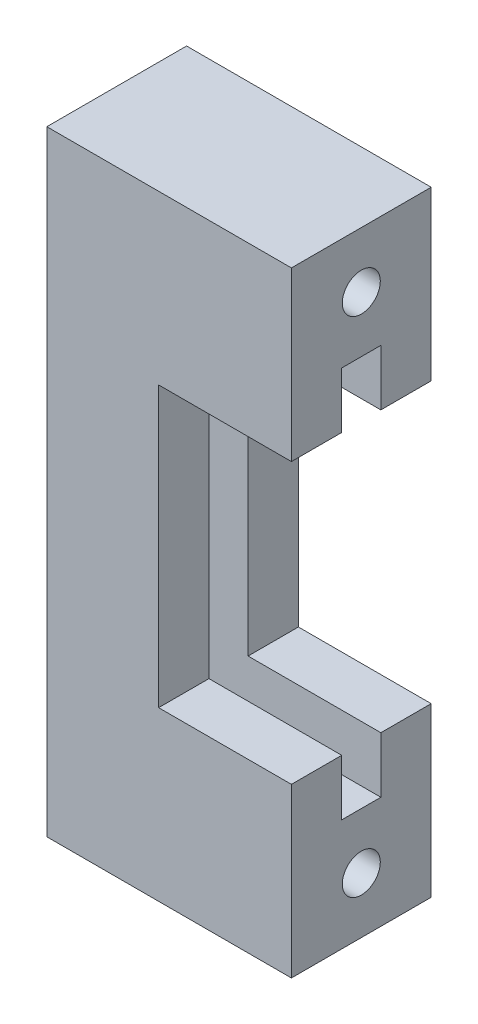
ISO-10303-21;
HEADER;
FILE_DESCRIPTION(('STEP AP214'),'2;1');
FILE_NAME('part.step','',(''),(''),'','','');
FILE_SCHEMA(('AUTOMOTIVE_DESIGN { 1 0 10303 214 1 1 1 1 }'));
ENDSEC;
DATA;
#1=APPLICATION_CONTEXT('core data for automotive mechanical design processes');
#2=APPLICATION_PROTOCOL_DEFINITION('international standard','automotive_design',2000,#1);
#3=PRODUCT_CONTEXT('',#1,'mechanical');
#4=PRODUCT('Part','Part','',(#3));
#5=PRODUCT_RELATED_PRODUCT_CATEGORY('part','',(#4));
#6=PRODUCT_DEFINITION_FORMATION('','',#4);
#7=PRODUCT_DEFINITION_CONTEXT('part definition',#1,'design');
#8=PRODUCT_DEFINITION('design','',#6,#7);
#9=PRODUCT_DEFINITION_SHAPE('','',#8);
#10=(LENGTH_UNIT() NAMED_UNIT(*) SI_UNIT(.MILLI.,.METRE.));
#11=(NAMED_UNIT(*) PLANE_ANGLE_UNIT() SI_UNIT($,.RADIAN.));
#12=(NAMED_UNIT(*) SI_UNIT($,.STERADIAN.) SOLID_ANGLE_UNIT());
#13=UNCERTAINTY_MEASURE_WITH_UNIT(LENGTH_MEASURE(1.E-05),#10,'distance_accuracy_value','');
#14=(GEOMETRIC_REPRESENTATION_CONTEXT(3) GLOBAL_UNCERTAINTY_ASSIGNED_CONTEXT((#13)) GLOBAL_UNIT_ASSIGNED_CONTEXT((#10,
#11,#12)) REPRESENTATION_CONTEXT('',''));
#15=CARTESIAN_POINT('',(0.,0.,0.));
#16=DIRECTION('',(0.,0.,1.));
#17=DIRECTION('',(1.,0.,0.));
#18=AXIS2_PLACEMENT_3D('',#15,#16,#17);
#19=CARTESIAN_POINT('',(0.,0.,4.572));
#20=DIRECTION('',(0.,0.,1.));
#21=DIRECTION('',(1.,0.,0.));
#22=AXIS2_PLACEMENT_3D('',#19,#20,#21);
#23=PLANE('',#22);
#24=DIRECTION('',(0.,-1.,0.));
#25=VECTOR('',#24,1.);
#26=CARTESIAN_POINT('',(-23.495,0.,4.572));
#27=LINE('',#26,#25);
#28=CARTESIAN_POINT('',(-23.495,45.72,4.572));
#29=VERTEX_POINT('',#28);
#30=CARTESIAN_POINT('',(-23.495,40.64,4.572));
#31=VERTEX_POINT('',#30);
#32=EDGE_CURVE('E213',#29,#31,#27,.T.);
#33=ORIENTED_EDGE('',*,*,#32,.F.);
#34=DIRECTION('',(-1.,0.,0.));
#35=VECTOR('',#34,1.);
#36=CARTESIAN_POINT('',(-40.64,45.72,4.572));
#37=LINE('',#36,#35);
#38=CARTESIAN_POINT('',(-40.64,45.72,4.572));
#39=VERTEX_POINT('',#38);
#40=EDGE_CURVE('E272',#29,#39,#37,.T.);
#41=ORIENTED_EDGE('',*,*,#40,.T.);
#42=DIRECTION('',(0.,-1.,0.));
#43=VECTOR('',#42,1.);
#44=CARTESIAN_POINT('',(-40.64,45.72,4.572));
#45=LINE('',#44,#43);
#46=CARTESIAN_POINT('',(-40.64,10.16,4.572));
#47=VERTEX_POINT('',#46);
#48=EDGE_CURVE('E275',#39,#47,#45,.T.);
#49=ORIENTED_EDGE('',*,*,#48,.T.);
#50=DIRECTION('',(1.,0.,0.));
#51=VECTOR('',#50,1.);
#52=CARTESIAN_POINT('',(-40.64,10.16,4.572));
#53=LINE('',#52,#51);
#54=CARTESIAN_POINT('',(-23.495,10.16,4.572));
#55=VERTEX_POINT('',#54);
#56=EDGE_CURVE('E276',#47,#55,#53,.T.);
#57=ORIENTED_EDGE('',*,*,#56,.T.);
#58=CARTESIAN_POINT('',(-23.495,15.24,4.572));
#59=VERTEX_POINT('',#58);
#60=EDGE_CURVE('E230',#59,#55,#27,.T.);
#61=ORIENTED_EDGE('',*,*,#60,.F.);
#62=DIRECTION('',(1.,0.,0.));
#63=VECTOR('',#62,1.);
#64=CARTESIAN_POINT('',(0.,15.24,4.572));
#65=LINE('',#64,#63);
#66=CARTESIAN_POINT('',(-35.56,15.24,4.572));
#67=VERTEX_POINT('',#66);
#68=EDGE_CURVE('E237',#67,#59,#65,.T.);
#69=ORIENTED_EDGE('',*,*,#68,.F.);
#70=DIRECTION('',(0.,-1.,0.));
#71=VECTOR('',#70,1.);
#72=CARTESIAN_POINT('',(-35.56,0.,4.572));
#73=LINE('',#72,#71);
#74=CARTESIAN_POINT('',(-35.56,40.64,4.572));
#75=VERTEX_POINT('',#74);
#76=EDGE_CURVE('E179',#75,#67,#73,.T.);
#77=ORIENTED_EDGE('',*,*,#76,.F.);
#78=DIRECTION('',(-1.,0.,0.));
#79=VECTOR('',#78,1.);
#80=CARTESIAN_POINT('',(0.,40.64,4.572));
#81=LINE('',#80,#79);
#82=EDGE_CURVE('E173',#31,#75,#81,.T.);
#83=ORIENTED_EDGE('',*,*,#82,.F.);
#84=EDGE_LOOP('',(#33,#41,#49,#57,#61,#69,#77,#83));
#85=FACE_BOUND('',#84,.T.);
#86=ADVANCED_FACE('F45',(#85),#23,.T.);
#87=CARTESIAN_POINT('',(-40.64,45.72,12.7));
#88=DIRECTION('',(0.,-1.,0.));
#89=DIRECTION('',(0.,0.,-1.));
#90=AXIS2_PLACEMENT_3D('',#87,#88,#89);
#91=PLANE('',#90);
#92=DIRECTION('',(0.,0.,-1.));
#93=VECTOR('',#92,1.);
#94=CARTESIAN_POINT('',(-23.495,45.72,12.7));
#95=LINE('',#94,#93);
#96=CARTESIAN_POINT('',(-23.495,45.72,8.128));
#97=VERTEX_POINT('',#96);
#98=EDGE_CURVE('E210',#97,#29,#95,.T.);
#99=ORIENTED_EDGE('',*,*,#98,.F.);
#100=DIRECTION('',(-1.,0.,0.));
#101=VECTOR('',#100,1.);
#102=CARTESIAN_POINT('',(-40.64,45.72,8.128));
#103=LINE('',#102,#101);
#104=CARTESIAN_POINT('',(-40.64,45.72,8.128));
#105=VERTEX_POINT('',#104);
#106=EDGE_CURVE('E280',#97,#105,#103,.T.);
#107=ORIENTED_EDGE('',*,*,#106,.T.);
#108=DIRECTION('',(0.,0.,-1.));
#109=VECTOR('',#108,1.);
#110=CARTESIAN_POINT('',(-40.64,45.72,12.7));
#111=LINE('',#110,#109);
#112=EDGE_CURVE('E283',#105,#39,#111,.T.);
#113=ORIENTED_EDGE('',*,*,#112,.T.);
#114=ORIENTED_EDGE('',*,*,#40,.F.);
#115=EDGE_LOOP('',(#99,#107,#113,#114));
#116=FACE_BOUND('',#115,.T.);
#117=ADVANCED_FACE('F399',(#116),#91,.T.);
#118=CARTESIAN_POINT('',(-40.64,10.16,12.7));
#119=DIRECTION('',(0.,1.,0.));
#120=DIRECTION('',(0.,0.,1.));
#121=AXIS2_PLACEMENT_3D('',#118,#119,#120);
#122=PLANE('',#121);
#123=DIRECTION('',(0.,0.,1.));
#124=VECTOR('',#123,1.);
#125=CARTESIAN_POINT('',(-23.495,10.16,12.7));
#126=LINE('',#125,#124);
#127=CARTESIAN_POINT('',(-23.495,10.16,8.128));
#128=VERTEX_POINT('',#127);
#129=EDGE_CURVE('E214',#55,#128,#126,.T.);
#130=ORIENTED_EDGE('',*,*,#129,.F.);
#131=ORIENTED_EDGE('',*,*,#56,.F.);
#132=DIRECTION('',(0.,0.,-1.));
#133=VECTOR('',#132,1.);
#134=CARTESIAN_POINT('',(-40.64,10.16,12.7));
#135=LINE('',#134,#133);
#136=CARTESIAN_POINT('',(-40.64,10.16,8.128));
#137=VERTEX_POINT('',#136);
#138=EDGE_CURVE('E308',#137,#47,#135,.T.);
#139=ORIENTED_EDGE('',*,*,#138,.F.);
#140=DIRECTION('',(1.,0.,0.));
#141=VECTOR('',#140,1.);
#142=CARTESIAN_POINT('',(-40.64,10.16,8.128));
#143=LINE('',#142,#141);
#144=EDGE_CURVE('E284',#137,#128,#143,.T.);
#145=ORIENTED_EDGE('',*,*,#144,.T.);
#146=EDGE_LOOP('',(#130,#131,#139,#145));
#147=FACE_BOUND('',#146,.T.);
#148=ADVANCED_FACE('F365',(#147),#122,.T.);
#149=CARTESIAN_POINT('',(0.,0.,8.128));
#150=DIRECTION('',(0.,0.,1.));
#151=DIRECTION('',(1.,0.,0.));
#152=AXIS2_PLACEMENT_3D('',#149,#150,#151);
#153=PLANE('',#152);
#154=ORIENTED_EDGE('',*,*,#106,.F.);
#155=DIRECTION('',(0.,-1.,0.));
#156=VECTOR('',#155,1.);
#157=CARTESIAN_POINT('',(-23.495,0.,8.128));
#158=LINE('',#157,#156);
#159=CARTESIAN_POINT('',(-23.495,40.64,8.128));
#160=VERTEX_POINT('',#159);
#161=EDGE_CURVE('E227',#97,#160,#158,.T.);
#162=ORIENTED_EDGE('',*,*,#161,.T.);
#163=DIRECTION('',(-1.,0.,0.));
#164=VECTOR('',#163,1.);
#165=CARTESIAN_POINT('',(0.,40.64,8.128));
#166=LINE('',#165,#164);
#167=CARTESIAN_POINT('',(-35.56,40.64,8.128));
#168=VERTEX_POINT('',#167);
#169=EDGE_CURVE('E253',#160,#168,#166,.T.);
#170=ORIENTED_EDGE('',*,*,#169,.T.);
#171=DIRECTION('',(0.,-1.,0.));
#172=VECTOR('',#171,1.);
#173=CARTESIAN_POINT('',(-35.56,0.,8.128));
#174=LINE('',#173,#172);
#175=CARTESIAN_POINT('',(-35.56,15.24,8.128));
#176=VERTEX_POINT('',#175);
#177=EDGE_CURVE('E256',#168,#176,#174,.T.);
#178=ORIENTED_EDGE('',*,*,#177,.T.);
#179=DIRECTION('',(1.,0.,0.));
#180=VECTOR('',#179,1.);
#181=CARTESIAN_POINT('',(0.,15.24,8.128));
#182=LINE('',#181,#180);
#183=CARTESIAN_POINT('',(-23.495,15.24,8.128));
#184=VERTEX_POINT('',#183);
#185=EDGE_CURVE('E226',#176,#184,#182,.T.);
#186=ORIENTED_EDGE('',*,*,#185,.T.);
#187=EDGE_CURVE('E222',#184,#128,#158,.T.);
#188=ORIENTED_EDGE('',*,*,#187,.T.);
#189=ORIENTED_EDGE('',*,*,#144,.F.);
#190=DIRECTION('',(0.,-1.,0.));
#191=VECTOR('',#190,1.);
#192=CARTESIAN_POINT('',(-40.64,45.72,8.128));
#193=LINE('',#192,#191);
#194=EDGE_CURVE('E205',#105,#137,#193,.T.);
#195=ORIENTED_EDGE('',*,*,#194,.F.);
#196=EDGE_LOOP('',(#154,#162,#170,#178,#186,#188,#189,#195));
#197=FACE_BOUND('',#196,.T.);
#198=ADVANCED_FACE('F327',(#197),#153,.F.);
#199=CARTESIAN_POINT('',(-35.56,15.24,0.));
#200=DIRECTION('',(0.,-1.,0.));
#201=DIRECTION('',(0.,0.,-1.));
#202=AXIS2_PLACEMENT_3D('',#199,#200,#201);
#203=PLANE('',#202);
#204=DIRECTION('',(1.,0.,0.));
#205=VECTOR('',#204,1.);
#206=CARTESIAN_POINT('',(-35.56,15.24,12.7));
#207=LINE('',#206,#205);
#208=CARTESIAN_POINT('',(-35.56,15.24,12.7));
#209=VERTEX_POINT('',#208);
#210=CARTESIAN_POINT('',(-23.495,15.24,12.7));
#211=VERTEX_POINT('',#210);
#212=EDGE_CURVE('E49',#209,#211,#207,.T.);
#213=ORIENTED_EDGE('',*,*,#212,.T.);
#214=DIRECTION('',(0.,0.,-1.));
#215=VECTOR('',#214,1.);
#216=CARTESIAN_POINT('',(-23.495,15.24,0.));
#217=LINE('',#216,#215);
#218=EDGE_CURVE('E218',#211,#184,#217,.T.);
#219=ORIENTED_EDGE('',*,*,#218,.T.);
#220=ORIENTED_EDGE('',*,*,#185,.F.);
#221=DIRECTION('',(0.,0.,1.));
#222=VECTOR('',#221,1.);
#223=CARTESIAN_POINT('',(-35.56,15.24,0.));
#224=LINE('',#223,#222);
#225=EDGE_CURVE('E209',#176,#209,#224,.T.);
#226=ORIENTED_EDGE('',*,*,#225,.T.);
#227=EDGE_LOOP('',(#213,#219,#220,#226));
#228=FACE_BOUND('',#227,.T.);
#229=ADVANCED_FACE('F324',(#228),#203,.F.);
#230=CARTESIAN_POINT('',(-35.56,40.64,0.));
#231=DIRECTION('',(0.,1.,0.));
#232=DIRECTION('',(0.,0.,1.));
#233=AXIS2_PLACEMENT_3D('',#230,#231,#232);
#234=PLANE('',#233);
#235=ORIENTED_EDGE('',*,*,#169,.F.);
#236=DIRECTION('',(0.,0.,1.));
#237=VECTOR('',#236,1.);
#238=CARTESIAN_POINT('',(-23.495,40.64,0.));
#239=LINE('',#238,#237);
#240=CARTESIAN_POINT('',(-23.495,40.64,12.7));
#241=VERTEX_POINT('',#240);
#242=EDGE_CURVE('E65',#160,#241,#239,.T.);
#243=ORIENTED_EDGE('',*,*,#242,.T.);
#244=DIRECTION('',(-1.,0.,0.));
#245=VECTOR('',#244,1.);
#246=CARTESIAN_POINT('',(-35.56,40.64,12.7));
#247=LINE('',#246,#245);
#248=CARTESIAN_POINT('',(-35.56,40.64,12.7));
#249=VERTEX_POINT('',#248);
#250=EDGE_CURVE('E208',#241,#249,#247,.T.);
#251=ORIENTED_EDGE('',*,*,#250,.T.);
#252=DIRECTION('',(0.,0.,1.));
#253=VECTOR('',#252,1.);
#254=CARTESIAN_POINT('',(-35.56,40.64,0.));
#255=LINE('',#254,#253);
#256=EDGE_CURVE('E181',#168,#249,#255,.T.);
#257=ORIENTED_EDGE('',*,*,#256,.F.);
#258=EDGE_LOOP('',(#235,#243,#251,#257));
#259=FACE_BOUND('',#258,.T.);
#260=ADVANCED_FACE('F298',(#259),#234,.F.);
#261=DIRECTION('',(-1.,0.,0.));
#262=VECTOR('',#261,1.);
#263=CARTESIAN_POINT('',(-35.56,40.64,0.));
#264=LINE('',#263,#262);
#265=CARTESIAN_POINT('',(-23.495,40.64,0.));
#266=VERTEX_POINT('',#265);
#267=CARTESIAN_POINT('',(-35.56,40.64,0.));
#268=VERTEX_POINT('',#267);
#269=EDGE_CURVE('E158',#266,#268,#264,.T.);
#270=ORIENTED_EDGE('',*,*,#269,.F.);
#271=DIRECTION('',(0.,0.,1.));
#272=VECTOR('',#271,1.);
#273=CARTESIAN_POINT('',(-23.495,40.64,0.));
#274=LINE('',#273,#272);
#275=EDGE_CURVE('E215',#266,#31,#274,.T.);
#276=ORIENTED_EDGE('',*,*,#275,.T.);
#277=ORIENTED_EDGE('',*,*,#82,.T.);
#278=EDGE_CURVE('E170',#268,#75,#255,.T.);
#279=ORIENTED_EDGE('',*,*,#278,.F.);
#280=EDGE_LOOP('',(#270,#276,#277,#279));
#281=FACE_BOUND('',#280,.T.);
#282=ADVANCED_FACE('F171',(#281),#234,.F.);
#283=ORIENTED_EDGE('',*,*,#68,.T.);
#284=DIRECTION('',(0.,0.,-1.));
#285=VECTOR('',#284,1.);
#286=CARTESIAN_POINT('',(-23.495,15.24,0.));
#287=LINE('',#286,#285);
#288=CARTESIAN_POINT('',(-23.495,15.24,0.));
#289=VERTEX_POINT('',#288);
#290=EDGE_CURVE('E233',#59,#289,#287,.T.);
#291=ORIENTED_EDGE('',*,*,#290,.T.);
#292=DIRECTION('',(1.,0.,0.));
#293=VECTOR('',#292,1.);
#294=CARTESIAN_POINT('',(-35.56,15.24,0.));
#295=LINE('',#294,#293);
#296=CARTESIAN_POINT('',(-35.56,15.24,0.));
#297=VERTEX_POINT('',#296);
#298=EDGE_CURVE('E187',#297,#289,#295,.T.);
#299=ORIENTED_EDGE('',*,*,#298,.F.);
#300=EDGE_CURVE('E184',#297,#67,#224,.T.);
#301=ORIENTED_EDGE('',*,*,#300,.T.);
#302=EDGE_LOOP('',(#283,#291,#299,#301));
#303=FACE_BOUND('',#302,.T.);
#304=ADVANCED_FACE('F499',(#303),#203,.F.);
#305=CARTESIAN_POINT('',(0.,0.,12.7));
#306=DIRECTION('',(0.,0.,1.));
#307=DIRECTION('',(1.,0.,0.));
#308=AXIS2_PLACEMENT_3D('',#305,#306,#307);
#309=PLANE('',#308);
#310=DIRECTION('',(0.,-1.,0.));
#311=VECTOR('',#310,1.);
#312=CARTESIAN_POINT('',(-23.495,55.88,12.7));
#313=LINE('',#312,#311);
#314=CARTESIAN_POINT('',(-23.495,55.88,12.7));
#315=VERTEX_POINT('',#314);
#316=EDGE_CURVE('E11',#315,#241,#313,.T.);
#317=ORIENTED_EDGE('',*,*,#316,.F.);
#318=DIRECTION('',(-1.,0.,0.));
#319=VECTOR('',#318,1.);
#320=CARTESIAN_POINT('',(-45.72,55.88,12.7));
#321=LINE('',#320,#319);
#322=CARTESIAN_POINT('',(-45.72,55.88,12.7));
#323=VERTEX_POINT('',#322);
#324=EDGE_CURVE('E260',#315,#323,#321,.T.);
#325=ORIENTED_EDGE('',*,*,#324,.T.);
#326=DIRECTION('',(0.,-1.,0.));
#327=VECTOR('',#326,1.);
#328=CARTESIAN_POINT('',(-45.72,55.88,12.7));
#329=LINE('',#328,#327);
#330=CARTESIAN_POINT('',(-45.72,0.,12.7));
#331=VERTEX_POINT('',#330);
#332=EDGE_CURVE('E263',#323,#331,#329,.T.);
#333=ORIENTED_EDGE('',*,*,#332,.T.);
#334=DIRECTION('',(1.,0.,0.));
#335=VECTOR('',#334,1.);
#336=CARTESIAN_POINT('',(-45.72,0.,12.7));
#337=LINE('',#336,#335);
#338=CARTESIAN_POINT('',(-23.495,0.,12.7));
#339=VERTEX_POINT('',#338);
#340=EDGE_CURVE('E252',#331,#339,#337,.T.);
#341=ORIENTED_EDGE('',*,*,#340,.T.);
#342=EDGE_CURVE('E58',#211,#339,#313,.T.);
#343=ORIENTED_EDGE('',*,*,#342,.F.);
#344=ORIENTED_EDGE('',*,*,#212,.F.);
#345=DIRECTION('',(0.,-1.,0.));
#346=VECTOR('',#345,1.);
#347=CARTESIAN_POINT('',(-35.56,40.64,12.7));
#348=LINE('',#347,#346);
#349=EDGE_CURVE('E194',#249,#209,#348,.T.);
#350=ORIENTED_EDGE('',*,*,#349,.F.);
#351=ORIENTED_EDGE('',*,*,#250,.F.);
#352=EDGE_LOOP('',(#317,#325,#333,#341,#343,#344,#350,#351));
#353=FACE_BOUND('',#352,.T.);
#354=ADVANCED_FACE('F310',(#353),#309,.T.);
#355=CARTESIAN_POINT('',(0.,0.,0.));
#356=DIRECTION('',(0.,0.,1.));
#357=DIRECTION('',(1.,0.,0.));
#358=AXIS2_PLACEMENT_3D('',#355,#356,#357);
#359=PLANE('',#358);
#360=DIRECTION('',(-1.,0.,0.));
#361=VECTOR('',#360,1.);
#362=CARTESIAN_POINT('',(-45.72,55.88,0.));
#363=LINE('',#362,#361);
#364=CARTESIAN_POINT('',(-23.495,55.88,0.));
#365=VERTEX_POINT('',#364);
#366=CARTESIAN_POINT('',(-45.72,55.88,0.));
#367=VERTEX_POINT('',#366);
#368=EDGE_CURVE('E241',#365,#367,#363,.T.);
#369=ORIENTED_EDGE('',*,*,#368,.F.);
#370=DIRECTION('',(0.,-1.,0.));
#371=VECTOR('',#370,1.);
#372=CARTESIAN_POINT('',(-23.495,55.88,0.));
#373=LINE('',#372,#371);
#374=EDGE_CURVE('E108',#365,#266,#373,.T.);
#375=ORIENTED_EDGE('',*,*,#374,.T.);
#376=ORIENTED_EDGE('',*,*,#269,.T.);
#377=DIRECTION('',(0.,-1.,0.));
#378=VECTOR('',#377,1.);
#379=CARTESIAN_POINT('',(-35.56,40.64,0.));
#380=LINE('',#379,#378);
#381=EDGE_CURVE('E164',#268,#297,#380,.T.);
#382=ORIENTED_EDGE('',*,*,#381,.T.);
#383=ORIENTED_EDGE('',*,*,#298,.T.);
#384=CARTESIAN_POINT('',(-23.495,0.,0.));
#385=VERTEX_POINT('',#384);
#386=EDGE_CURVE('E190',#289,#385,#373,.T.);
#387=ORIENTED_EDGE('',*,*,#386,.T.);
#388=DIRECTION('',(1.,0.,0.));
#389=VECTOR('',#388,1.);
#390=CARTESIAN_POINT('',(-45.72,0.,0.));
#391=LINE('',#390,#389);
#392=CARTESIAN_POINT('',(-45.72,0.,0.));
#393=VERTEX_POINT('',#392);
#394=EDGE_CURVE('E247',#393,#385,#391,.T.);
#395=ORIENTED_EDGE('',*,*,#394,.F.);
#396=DIRECTION('',(0.,-1.,0.));
#397=VECTOR('',#396,1.);
#398=CARTESIAN_POINT('',(-45.72,55.88,0.));
#399=LINE('',#398,#397);
#400=EDGE_CURVE('E178',#367,#393,#399,.T.);
#401=ORIENTED_EDGE('',*,*,#400,.F.);
#402=EDGE_LOOP('',(#369,#375,#376,#382,#383,#387,#395,#401));
#403=FACE_BOUND('',#402,.T.);
#404=ADVANCED_FACE('F161',(#403),#359,.F.);
#405=CARTESIAN_POINT('',(-45.72,0.,12.7));
#406=DIRECTION('',(0.,1.,0.));
#407=DIRECTION('',(0.,0.,1.));
#408=AXIS2_PLACEMENT_3D('',#405,#406,#407);
#409=PLANE('',#408);
#410=ORIENTED_EDGE('',*,*,#394,.T.);
#411=DIRECTION('',(0.,0.,1.));
#412=VECTOR('',#411,1.);
#413=CARTESIAN_POINT('',(-23.495,0.,0.));
#414=LINE('',#413,#412);
#415=EDGE_CURVE('E242',#385,#339,#414,.T.);
#416=ORIENTED_EDGE('',*,*,#415,.T.);
#417=ORIENTED_EDGE('',*,*,#340,.F.);
#418=DIRECTION('',(0.,0.,-1.));
#419=VECTOR('',#418,1.);
#420=CARTESIAN_POINT('',(-45.72,0.,12.7));
#421=LINE('',#420,#419);
#422=EDGE_CURVE('E246',#331,#393,#421,.T.);
#423=ORIENTED_EDGE('',*,*,#422,.T.);
#424=EDGE_LOOP('',(#410,#416,#417,#423));
#425=FACE_BOUND('',#424,.T.);
#426=ADVANCED_FACE('F377',(#425),#409,.F.);
#427=CARTESIAN_POINT('',(-45.72,55.88,12.7));
#428=DIRECTION('',(0.,-1.,0.));
#429=DIRECTION('',(0.,0.,-1.));
#430=AXIS2_PLACEMENT_3D('',#427,#428,#429);
#431=PLANE('',#430);
#432=ORIENTED_EDGE('',*,*,#324,.F.);
#433=DIRECTION('',(0.,0.,1.));
#434=VECTOR('',#433,1.);
#435=CARTESIAN_POINT('',(-23.495,55.88,0.));
#436=LINE('',#435,#434);
#437=EDGE_CURVE('E56',#365,#315,#436,.T.);
#438=ORIENTED_EDGE('',*,*,#437,.F.);
#439=ORIENTED_EDGE('',*,*,#368,.T.);
#440=DIRECTION('',(0.,0.,-1.));
#441=VECTOR('',#440,1.);
#442=CARTESIAN_POINT('',(-45.72,55.88,12.7));
#443=LINE('',#442,#441);
#444=EDGE_CURVE('E335',#323,#367,#443,.T.);
#445=ORIENTED_EDGE('',*,*,#444,.F.);
#446=EDGE_LOOP('',(#432,#438,#439,#445));
#447=FACE_BOUND('',#446,.T.);
#448=ADVANCED_FACE('F385',(#447),#431,.F.);
#449=CARTESIAN_POINT('',(0.,50.8,6.35));
#450=DIRECTION('',(-1.,0.,0.));
#451=DIRECTION('',(0.,-1.,0.));
#452=AXIS2_PLACEMENT_3D('',#449,#450,#451);
#453=CYLINDRICAL_SURFACE('',#452,1.7272);
#454=CARTESIAN_POINT('',(-23.495,50.8,6.35));
#455=DIRECTION('',(-1.,0.,0.));
#456=DIRECTION('',(0.,-1.,0.));
#457=AXIS2_PLACEMENT_3D('',#454,#455,#456);
#458=CIRCLE('',#457,1.7272);
#459=CARTESIAN_POINT('',(-23.495,49.0728,6.35));
#460=VERTEX_POINT('',#459);
#461=EDGE_CURVE('E200',#460,#460,#458,.F.);
#462=ORIENTED_EDGE('',*,*,#461,.T.);
#463=EDGE_LOOP('',(#462));
#464=FACE_BOUND('',#463,.T.);
#465=CARTESIAN_POINT('',(-45.72,50.8,6.35));
#466=DIRECTION('',(-1.,0.,0.));
#467=DIRECTION('',(0.,-1.,0.));
#468=AXIS2_PLACEMENT_3D('',#465,#466,#467);
#469=CIRCLE('',#468,1.7272);
#470=CARTESIAN_POINT('',(-45.72,49.0728,6.35));
#471=VERTEX_POINT('',#470);
#472=EDGE_CURVE('E195',#471,#471,#469,.T.);
#473=ORIENTED_EDGE('',*,*,#472,.T.);
#474=EDGE_LOOP('',(#473));
#475=FACE_BOUND('',#474,.T.);
#476=ADVANCED_FACE('F407',(#464,#475),#453,.F.);
#477=CARTESIAN_POINT('',(0.,5.07999999999999,6.35));
#478=DIRECTION('',(-1.,0.,0.));
#479=DIRECTION('',(0.,-1.,0.));
#480=AXIS2_PLACEMENT_3D('',#477,#478,#479);
#481=CYLINDRICAL_SURFACE('',#480,1.7272);
#482=CARTESIAN_POINT('',(-23.495,5.08,6.35));
#483=DIRECTION('',(-1.,0.,0.));
#484=DIRECTION('',(0.,-1.,0.));
#485=AXIS2_PLACEMENT_3D('',#482,#483,#484);
#486=CIRCLE('',#485,1.7272);
#487=CARTESIAN_POINT('',(-23.495,3.3528,6.35));
#488=VERTEX_POINT('',#487);
#489=EDGE_CURVE('E199',#488,#488,#486,.F.);
#490=CARTESIAN_POINT('',(-45.72,5.08,6.35));
#491=DIRECTION('',(-1.,0.,0.));
#492=DIRECTION('',(0.,-1.,0.));
#493=AXIS2_PLACEMENT_3D('',#490,#491,#492);
#494=CIRCLE('',#493,1.7272);
#495=CARTESIAN_POINT('',(-45.72,3.3528,6.35));
#496=VERTEX_POINT('',#495);
#497=EDGE_CURVE('E201',#496,#496,#494,.T.);
#498=CARTESIAN_POINT('',(-23.495,3.3528,6.35));
#499=CARTESIAN_POINT('',(-23.7265104166667,3.3528,6.35));
#500=CARTESIAN_POINT('',(-23.9580208333333,3.3528,6.35));
#501=CARTESIAN_POINT('',(-24.4210416666667,3.3528,6.35));
#502=CARTESIAN_POINT('',(-24.6525520833333,3.3528,6.35));
#503=CARTESIAN_POINT('',(-25.1155729166667,3.3528,6.35));
#504=CARTESIAN_POINT('',(-25.3470833333333,3.3528,6.35));
#505=CARTESIAN_POINT('',(-25.8101041666667,3.3528,6.35));
#506=CARTESIAN_POINT('',(-26.0416145833333,3.3528,6.35));
#507=CARTESIAN_POINT('',(-26.5046354166667,3.3528,6.35));
#508=CARTESIAN_POINT('',(-26.7361458333333,3.3528,6.35));
#509=CARTESIAN_POINT('',(-27.1991666666667,3.3528,6.35));
#510=CARTESIAN_POINT('',(-27.4306770833333,3.3528,6.35));
#511=CARTESIAN_POINT('',(-27.8936979166667,3.3528,6.35));
#512=CARTESIAN_POINT('',(-28.1252083333333,3.3528,6.35));
#513=CARTESIAN_POINT('',(-28.5882291666667,3.3528,6.35));
#514=CARTESIAN_POINT('',(-28.8197395833333,3.3528,6.35));
#515=CARTESIAN_POINT('',(-29.2827604166667,3.3528,6.35));
#516=CARTESIAN_POINT('',(-29.5142708333333,3.3528,6.35));
#517=CARTESIAN_POINT('',(-29.9772916666667,3.3528,6.35));
#518=CARTESIAN_POINT('',(-30.2088020833333,3.3528,6.35));
#519=CARTESIAN_POINT('',(-30.6718229166667,3.3528,6.35));
#520=CARTESIAN_POINT('',(-30.9033333333333,3.3528,6.35));
#521=CARTESIAN_POINT('',(-31.3663541666667,3.3528,6.35));
#522=CARTESIAN_POINT('',(-31.5978645833333,3.3528,6.35));
#523=CARTESIAN_POINT('',(-32.0608854166667,3.3528,6.35));
#524=CARTESIAN_POINT('',(-32.2923958333333,3.3528,6.35));
#525=CARTESIAN_POINT('',(-32.7554166666667,3.3528,6.35));
#526=CARTESIAN_POINT('',(-32.9869270833333,3.3528,6.35));
#527=CARTESIAN_POINT('',(-33.4499479166667,3.3528,6.35));
#528=CARTESIAN_POINT('',(-33.6814583333333,3.3528,6.35));
#529=CARTESIAN_POINT('',(-34.1444791666667,3.3528,6.35));
#530=CARTESIAN_POINT('',(-34.3759895833333,3.3528,6.35));
#531=CARTESIAN_POINT('',(-34.8390104166667,3.3528,6.35));
#532=CARTESIAN_POINT('',(-35.0705208333333,3.3528,6.35));
#533=CARTESIAN_POINT('',(-35.5335416666667,3.3528,6.35));
#534=CARTESIAN_POINT('',(-35.7650520833333,3.3528,6.35));
#535=CARTESIAN_POINT('',(-36.2280729166667,3.3528,6.35));
#536=CARTESIAN_POINT('',(-36.4595833333333,3.3528,6.35));
#537=CARTESIAN_POINT('',(-36.9226041666667,3.3528,6.35));
#538=CARTESIAN_POINT('',(-37.1541145833333,3.3528,6.35));
#539=CARTESIAN_POINT('',(-37.6171354166667,3.3528,6.35));
#540=CARTESIAN_POINT('',(-37.8486458333333,3.3528,6.35));
#541=CARTESIAN_POINT('',(-38.3116666666667,3.3528,6.35));
#542=CARTESIAN_POINT('',(-38.5431770833333,3.3528,6.35));
#543=CARTESIAN_POINT('',(-39.0061979166667,3.3528,6.35));
#544=CARTESIAN_POINT('',(-39.2377083333333,3.3528,6.35));
#545=CARTESIAN_POINT('',(-39.7007291666667,3.3528,6.35));
#546=CARTESIAN_POINT('',(-39.9322395833333,3.3528,6.35));
#547=CARTESIAN_POINT('',(-40.3952604166667,3.3528,6.35));
#548=CARTESIAN_POINT('',(-40.6267708333333,3.3528,6.35));
#549=CARTESIAN_POINT('',(-41.0897916666667,3.3528,6.35));
#550=CARTESIAN_POINT('',(-41.3213020833333,3.3528,6.35));
#551=CARTESIAN_POINT('',(-41.7843229166667,3.3528,6.35));
#552=CARTESIAN_POINT('',(-42.0158333333333,3.3528,6.35));
#553=CARTESIAN_POINT('',(-42.4788541666667,3.3528,6.35));
#554=CARTESIAN_POINT('',(-42.7103645833333,3.3528,6.35));
#555=CARTESIAN_POINT('',(-43.1733854166667,3.3528,6.35));
#556=CARTESIAN_POINT('',(-43.4048958333333,3.3528,6.35));
#557=CARTESIAN_POINT('',(-43.8679166666667,3.3528,6.35));
#558=CARTESIAN_POINT('',(-44.0994270833333,3.3528,6.35));
#559=CARTESIAN_POINT('',(-44.5624479166667,3.3528,6.35));
#560=CARTESIAN_POINT('',(-44.7939583333333,3.3528,6.35));
#561=CARTESIAN_POINT('',(-45.2569791666667,3.3528,6.35));
#562=CARTESIAN_POINT('',(-45.4884895833333,3.3528,6.35));
#563=CARTESIAN_POINT('',(-45.72,3.3528,6.35));
#564=B_SPLINE_CURVE_WITH_KNOTS('',3,(#498,#499,#500,#501,#502,#503,#504,#505,#506,#507,#508,
#509,#510,#511,#512,#513,#514,#515,#516,#517,#518,#519,#520,#521,#522,#523,#524,#525,#526,#527,
#528,#529,#530,#531,#532,#533,#534,#535,#536,#537,#538,#539,#540,#541,#542,#543,#544,#545,#546,
#547,#548,#549,#550,#551,#552,#553,#554,#555,#556,#557,#558,#559,#560,#561,#562,#563),
.UNSPECIFIED.,.F.,.F.,(4,2,2,2,2,2,2,2,2,2,2,2,2,2,2,2,2,2,2,2,2,2,2,2,2,2,2,2,2,2,2,2,4),(0.,
0.694531250000002,1.3890625,2.08359375,2.778125,3.47265625,4.1671875,4.86171875,
5.55625000000001,6.25078125000001,6.94531250000001,7.63984375000001,8.334375,9.02890625000001,
9.7234375,10.41796875,11.1125,11.80703125,12.5015625,13.19609375,13.890625,14.58515625,
15.2796875,15.97421875,16.66875,17.36328125,18.0578125,18.75234375,19.446875,20.14140625,
20.8359375,21.53046875,22.225),.UNSPECIFIED.);
#565=EDGE_CURVE('BSEAM47',#488,#496,#564,.T.);
#566=ORIENTED_EDGE('',*,*,#489,.T.);
#567=ORIENTED_EDGE('',*,*,#497,.T.);
#568=ORIENTED_EDGE('',*,*,#565,.T.);
#569=ORIENTED_EDGE('',*,*,#565,.F.);
#570=EDGE_LOOP('',(#566,#568,#567,#569));
#571=FACE_BOUND('',#570,.T.);
#572=ADVANCED_FACE('F47',(#571),#481,.F.);
#573=CARTESIAN_POINT('',(-40.64,45.72,12.7));
#574=DIRECTION('',(1.,0.,0.));
#575=DIRECTION('',(0.,1.,0.));
#576=AXIS2_PLACEMENT_3D('',#573,#574,#575);
#577=PLANE('',#576);
#578=ORIENTED_EDGE('',*,*,#112,.F.);
#579=ORIENTED_EDGE('',*,*,#194,.T.);
#580=ORIENTED_EDGE('',*,*,#138,.T.);
#581=ORIENTED_EDGE('',*,*,#48,.F.);
#582=EDGE_LOOP('',(#578,#579,#580,#581));
#583=FACE_BOUND('',#582,.T.);
#584=ADVANCED_FACE('F359',(#583),#577,.T.);
#585=CARTESIAN_POINT('',(-35.56,40.64,0.));
#586=DIRECTION('',(-1.,0.,0.));
#587=DIRECTION('',(0.,0.,1.));
#588=AXIS2_PLACEMENT_3D('',#585,#586,#587);
#589=PLANE('',#588);
#590=ORIENTED_EDGE('',*,*,#256,.T.);
#591=ORIENTED_EDGE('',*,*,#349,.T.);
#592=ORIENTED_EDGE('',*,*,#225,.F.);
#593=ORIENTED_EDGE('',*,*,#177,.F.);
#594=EDGE_LOOP('',(#590,#591,#592,#593));
#595=FACE_BOUND('',#594,.T.);
#596=ADVANCED_FACE('F303',(#595),#589,.F.);
#597=ORIENTED_EDGE('',*,*,#76,.T.);
#598=ORIENTED_EDGE('',*,*,#300,.F.);
#599=ORIENTED_EDGE('',*,*,#381,.F.);
#600=ORIENTED_EDGE('',*,*,#278,.T.);
#601=EDGE_LOOP('',(#597,#598,#599,#600));
#602=FACE_BOUND('',#601,.T.);
#603=ADVANCED_FACE('F183',(#602),#589,.F.);
#604=CARTESIAN_POINT('',(-45.72,55.88,12.7));
#605=DIRECTION('',(1.,0.,0.));
#606=DIRECTION('',(0.,1.,0.));
#607=AXIS2_PLACEMENT_3D('',#604,#605,#606);
#608=PLANE('',#607);
#609=ORIENTED_EDGE('',*,*,#497,.F.);
#610=EDGE_LOOP('',(#609));
#611=FACE_BOUND('',#610,.T.);
#612=ORIENTED_EDGE('',*,*,#472,.F.);
#613=EDGE_LOOP('',(#612));
#614=FACE_BOUND('',#613,.T.);
#615=ORIENTED_EDGE('',*,*,#400,.T.);
#616=ORIENTED_EDGE('',*,*,#422,.F.);
#617=ORIENTED_EDGE('',*,*,#332,.F.);
#618=ORIENTED_EDGE('',*,*,#444,.T.);
#619=EDGE_LOOP('',(#615,#616,#617,#618));
#620=FACE_BOUND('',#619,.T.);
#621=ADVANCED_FACE('F381',(#611,#614,#620),#608,.F.);
#622=CARTESIAN_POINT('',(-23.495,55.88,0.));
#623=DIRECTION('',(-1.,0.,0.));
#624=DIRECTION('',(0.,-1.,0.));
#625=AXIS2_PLACEMENT_3D('',#622,#623,#624);
#626=PLANE('',#625);
#627=ORIENTED_EDGE('',*,*,#489,.F.);
#628=EDGE_LOOP('',(#627));
#629=FACE_BOUND('',#628,.T.);
#630=ORIENTED_EDGE('',*,*,#342,.T.);
#631=ORIENTED_EDGE('',*,*,#415,.F.);
#632=ORIENTED_EDGE('',*,*,#386,.F.);
#633=ORIENTED_EDGE('',*,*,#290,.F.);
#634=ORIENTED_EDGE('',*,*,#60,.T.);
#635=ORIENTED_EDGE('',*,*,#129,.T.);
#636=ORIENTED_EDGE('',*,*,#187,.F.);
#637=ORIENTED_EDGE('',*,*,#218,.F.);
#638=EDGE_LOOP('',(#630,#631,#632,#633,#634,#635,#636,#637));
#639=FACE_BOUND('',#638,.T.);
#640=ADVANCED_FACE('F368',(#629,#639),#626,.F.);
#641=ORIENTED_EDGE('',*,*,#461,.F.);
#642=EDGE_LOOP('',(#641));
#643=FACE_BOUND('',#642,.T.);
#644=ORIENTED_EDGE('',*,*,#161,.F.);
#645=ORIENTED_EDGE('',*,*,#98,.T.);
#646=ORIENTED_EDGE('',*,*,#32,.T.);
#647=ORIENTED_EDGE('',*,*,#275,.F.);
#648=ORIENTED_EDGE('',*,*,#374,.F.);
#649=ORIENTED_EDGE('',*,*,#437,.T.);
#650=ORIENTED_EDGE('',*,*,#316,.T.);
#651=ORIENTED_EDGE('',*,*,#242,.F.);
#652=EDGE_LOOP('',(#644,#645,#646,#647,#648,#649,#650,#651));
#653=FACE_BOUND('',#652,.T.);
#654=ADVANCED_FACE('F386',(#643,#653),#626,.F.);
#655=CLOSED_SHELL('',(#86,#117,#148,#198,#229,#260,#282,#304,#354,#404,#426,#448,#476,#572,#584,
#596,#603,#621,#640,#654));
#656=MANIFOLD_SOLID_BREP('B2',#655);
#657=ADVANCED_BREP_SHAPE_REPRESENTATION('',(#18,#656),#14);
#658=SHAPE_DEFINITION_REPRESENTATION(#9,#657);
ENDSEC;
END-ISO-10303-21;
